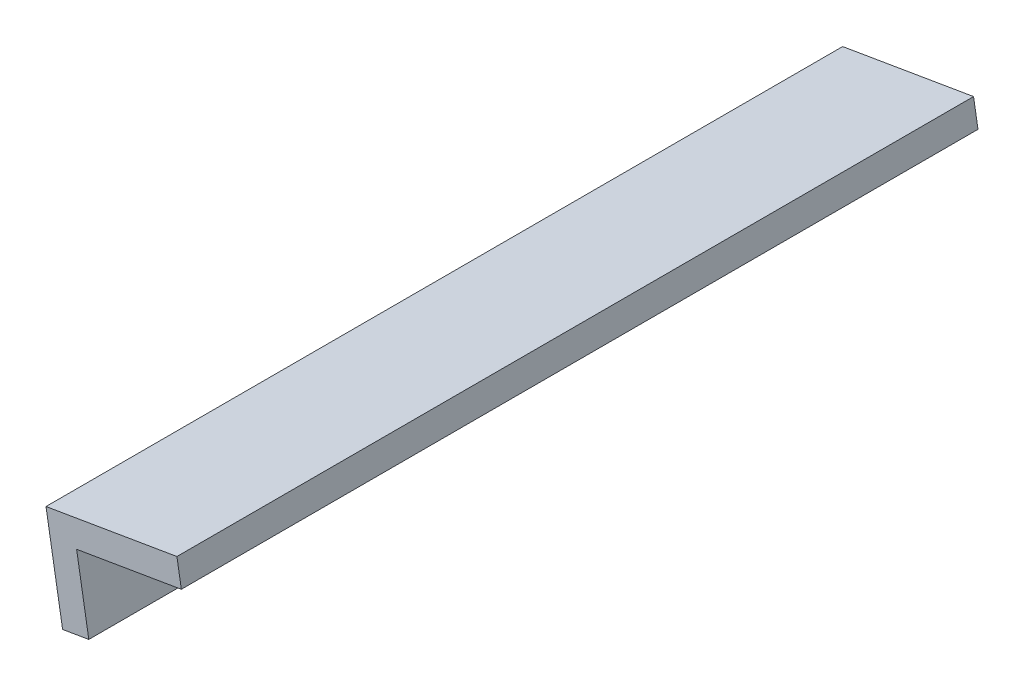
ISO-10303-21;
HEADER;
FILE_DESCRIPTION(('STEP AP214'),'2;1');
FILE_NAME('part.step','',(''),(''),'','','');
FILE_SCHEMA(('AUTOMOTIVE_DESIGN { 1 0 10303 214 1 1 1 1 }'));
ENDSEC;
DATA;
#1=APPLICATION_CONTEXT('core data for automotive mechanical design processes');
#2=APPLICATION_PROTOCOL_DEFINITION('international standard','automotive_design',2000,#1);
#3=PRODUCT_CONTEXT('',#1,'mechanical');
#4=PRODUCT('Part','Part','',(#3));
#5=PRODUCT_RELATED_PRODUCT_CATEGORY('part','',(#4));
#6=PRODUCT_DEFINITION_FORMATION('','',#4);
#7=PRODUCT_DEFINITION_CONTEXT('part definition',#1,'design');
#8=PRODUCT_DEFINITION('design','',#6,#7);
#9=PRODUCT_DEFINITION_SHAPE('','',#8);
#10=(LENGTH_UNIT() NAMED_UNIT(*) SI_UNIT(.MILLI.,.METRE.));
#11=(NAMED_UNIT(*) PLANE_ANGLE_UNIT() SI_UNIT($,.RADIAN.));
#12=(NAMED_UNIT(*) SI_UNIT($,.STERADIAN.) SOLID_ANGLE_UNIT());
#13=UNCERTAINTY_MEASURE_WITH_UNIT(LENGTH_MEASURE(1.E-05),#10,'distance_accuracy_value','');
#14=(GEOMETRIC_REPRESENTATION_CONTEXT(3) GLOBAL_UNCERTAINTY_ASSIGNED_CONTEXT((#13)) GLOBAL_UNIT_ASSIGNED_CONTEXT((#10,
#11,#12)) REPRESENTATION_CONTEXT('',''));
#15=CARTESIAN_POINT('',(0.,0.,0.));
#16=DIRECTION('',(0.,0.,1.));
#17=DIRECTION('',(1.,0.,0.));
#18=AXIS2_PLACEMENT_3D('',#15,#16,#17);
#19=CARTESIAN_POINT('',(-124.766828541344,248.500328158799,-152.4));
#20=DIRECTION('',(-0.98599202161082,-0.166792485801395,0.));
#21=DIRECTION('',(0.166792485801395,-0.98599202161082,0.));
#22=AXIS2_PLACEMENT_3D('',#19,#20,#21);
#23=PLANE('',#22);
#24=DIRECTION('',(0.166792485801395,-0.98599202161082,0.));
#25=VECTOR('',#24,1.);
#26=CARTESIAN_POINT('',(-124.766828541344,248.500328158799,0.));
#27=LINE('',#26,#25);
#28=CARTESIAN_POINT('',(-124.766828541344,248.500328158799,0.));
#29=VERTEX_POINT('',#28);
#30=CARTESIAN_POINT('',(-121.589431686828,229.717180147113,0.));
#31=VERTEX_POINT('',#30);
#32=EDGE_CURVE('E117',#29,#31,#27,.T.);
#33=ORIENTED_EDGE('',*,*,#32,.F.);
#34=DIRECTION('',(0.,0.,1.));
#35=VECTOR('',#34,1.);
#36=CARTESIAN_POINT('',(-124.766828541344,248.500328158799,-152.4));
#37=LINE('',#36,#35);
#38=CARTESIAN_POINT('',(-124.766828541344,248.500328158799,-152.4));
#39=VERTEX_POINT('',#38);
#40=EDGE_CURVE('E11',#39,#29,#37,.T.);
#41=ORIENTED_EDGE('',*,*,#40,.F.);
#42=DIRECTION('',(0.166792485801395,-0.98599202161082,0.));
#43=VECTOR('',#42,1.);
#44=CARTESIAN_POINT('',(-124.766828541344,248.500328158799,-152.4));
#45=LINE('',#44,#43);
#46=CARTESIAN_POINT('',(-121.589431686828,229.717180147113,-152.4));
#47=VERTEX_POINT('',#46);
#48=EDGE_CURVE('E131',#39,#47,#45,.T.);
#49=ORIENTED_EDGE('',*,*,#48,.T.);
#50=DIRECTION('',(0.,0.,1.));
#51=VECTOR('',#50,1.);
#52=CARTESIAN_POINT('',(-121.589431686828,229.717180147113,-152.4));
#53=LINE('',#52,#51);
#54=EDGE_CURVE('E35',#47,#31,#53,.T.);
#55=ORIENTED_EDGE('',*,*,#54,.T.);
#56=EDGE_LOOP('',(#33,#41,#49,#55));
#57=FACE_BOUND('',#56,.T.);
#58=ADVANCED_FACE('F32',(#57),#23,.T.);
#59=CARTESIAN_POINT('',(-124.766828541344,248.500328158799,-152.4));
#60=DIRECTION('',(-0.166792485801395,0.98599202161082,0.));
#61=DIRECTION('',(-0.98599202161082,-0.166792485801395,0.));
#62=AXIS2_PLACEMENT_3D('',#59,#60,#61);
#63=PLANE('',#62);
#64=DIRECTION('',(-0.98599202161082,-0.166792485801395,0.));
#65=VECTOR('',#64,1.);
#66=CARTESIAN_POINT('',(-124.766828541344,248.500328158799,0.));
#67=LINE('',#66,#65);
#68=CARTESIAN_POINT('',(-99.7226311924294,252.736857298154,0.));
#69=VERTEX_POINT('',#68);
#70=EDGE_CURVE('E129',#69,#29,#67,.T.);
#71=ORIENTED_EDGE('',*,*,#70,.F.);
#72=DIRECTION('',(0.,0.,1.));
#73=VECTOR('',#72,1.);
#74=CARTESIAN_POINT('',(-99.7226311924294,252.736857298154,-152.4));
#75=LINE('',#74,#73);
#76=CARTESIAN_POINT('',(-99.7226311924294,252.736857298154,-152.4));
#77=VERTEX_POINT('',#76);
#78=EDGE_CURVE('E41',#77,#69,#75,.T.);
#79=ORIENTED_EDGE('',*,*,#78,.F.);
#80=DIRECTION('',(-0.98599202161082,-0.166792485801395,0.));
#81=VECTOR('',#80,1.);
#82=CARTESIAN_POINT('',(-124.766828541344,248.500328158799,-152.4));
#83=LINE('',#82,#81);
#84=EDGE_CURVE('E107',#77,#39,#83,.T.);
#85=ORIENTED_EDGE('',*,*,#84,.T.);
#86=ORIENTED_EDGE('',*,*,#40,.T.);
#87=EDGE_LOOP('',(#71,#79,#85,#86));
#88=FACE_BOUND('',#87,.T.);
#89=ADVANCED_FACE('F139',(#88),#63,.T.);
#90=CARTESIAN_POINT('',(-99.7226311924294,252.736857298154,-152.4));
#91=DIRECTION('',(0.98599202161082,0.166792485801394,0.));
#92=DIRECTION('',(-0.166792485801394,0.98599202161082,0.));
#93=AXIS2_PLACEMENT_3D('',#90,#91,#92);
#94=PLANE('',#93);
#95=DIRECTION('',(-0.166792485801394,0.98599202161082,0.));
#96=VECTOR('',#95,1.);
#97=CARTESIAN_POINT('',(-99.7226311924294,252.736857298154,0.));
#98=LINE('',#97,#96);
#99=CARTESIAN_POINT('',(-98.8753253645583,247.728017828371,0.));
#100=VERTEX_POINT('',#99);
#101=EDGE_CURVE('E94',#100,#69,#98,.T.);
#102=ORIENTED_EDGE('',*,*,#101,.F.);
#103=DIRECTION('',(0.,0.,1.));
#104=VECTOR('',#103,1.);
#105=CARTESIAN_POINT('',(-98.8753253645583,247.728017828371,-152.4));
#106=LINE('',#105,#104);
#107=CARTESIAN_POINT('',(-98.8753253645583,247.728017828371,-152.4));
#108=VERTEX_POINT('',#107);
#109=EDGE_CURVE('E89',#108,#100,#106,.T.);
#110=ORIENTED_EDGE('',*,*,#109,.F.);
#111=DIRECTION('',(-0.166792485801394,0.98599202161082,0.));
#112=VECTOR('',#111,1.);
#113=CARTESIAN_POINT('',(-99.7226311924294,252.736857298154,-152.4));
#114=LINE('',#113,#112);
#115=EDGE_CURVE('E92',#108,#77,#114,.T.);
#116=ORIENTED_EDGE('',*,*,#115,.T.);
#117=ORIENTED_EDGE('',*,*,#78,.T.);
#118=EDGE_LOOP('',(#102,#110,#116,#117));
#119=FACE_BOUND('',#118,.T.);
#120=ADVANCED_FACE('F91',(#119),#94,.T.);
#121=CARTESIAN_POINT('',(-98.8753253645583,247.728017828371,-152.4));
#122=DIRECTION('',(0.166792485801395,-0.98599202161082,0.));
#123=DIRECTION('',(0.98599202161082,0.166792485801395,0.));
#124=AXIS2_PLACEMENT_3D('',#121,#122,#123);
#125=PLANE('',#124);
#126=DIRECTION('',(0.98599202161082,0.166792485801395,0.));
#127=VECTOR('',#126,1.);
#128=CARTESIAN_POINT('',(-98.8753253645583,247.728017828371,0.));
#129=LINE('',#128,#127);
#130=CARTESIAN_POINT('',(-118.91068324369,244.338794516887,0.));
#131=VERTEX_POINT('',#130);
#132=EDGE_CURVE('E126',#131,#100,#129,.T.);
#133=ORIENTED_EDGE('',*,*,#132,.F.);
#134=DIRECTION('',(0.,0.,1.));
#135=VECTOR('',#134,1.);
#136=CARTESIAN_POINT('',(-118.91068324369,244.338794516887,-152.4));
#137=LINE('',#136,#135);
#138=CARTESIAN_POINT('',(-118.91068324369,244.338794516887,-152.4));
#139=VERTEX_POINT('',#138);
#140=EDGE_CURVE('E99',#139,#131,#137,.T.);
#141=ORIENTED_EDGE('',*,*,#140,.F.);
#142=DIRECTION('',(0.98599202161082,0.166792485801395,0.));
#143=VECTOR('',#142,1.);
#144=CARTESIAN_POINT('',(-98.8753253645583,247.728017828371,-152.4));
#145=LINE('',#144,#143);
#146=EDGE_CURVE('E105',#139,#108,#145,.T.);
#147=ORIENTED_EDGE('',*,*,#146,.T.);
#148=ORIENTED_EDGE('',*,*,#109,.T.);
#149=EDGE_LOOP('',(#133,#141,#147,#148));
#150=FACE_BOUND('',#149,.T.);
#151=ADVANCED_FACE('F109',(#150),#125,.T.);
#152=CARTESIAN_POINT('',(-118.91068324369,244.338794516887,-152.4));
#153=DIRECTION('',(0.98599202161082,0.166792485801395,0.));
#154=DIRECTION('',(-0.166792485801395,0.98599202161082,0.));
#155=AXIS2_PLACEMENT_3D('',#152,#153,#154);
#156=PLANE('',#155);
#157=DIRECTION('',(-0.166792485801395,0.98599202161082,0.));
#158=VECTOR('',#157,1.);
#159=CARTESIAN_POINT('',(-118.91068324369,244.338794516887,0.));
#160=LINE('',#159,#158);
#161=CARTESIAN_POINT('',(-116.580592217045,230.564485974984,0.));
#162=VERTEX_POINT('',#161);
#163=EDGE_CURVE('E123',#162,#131,#160,.T.);
#164=ORIENTED_EDGE('',*,*,#163,.F.);
#165=DIRECTION('',(0.,0.,1.));
#166=VECTOR('',#165,1.);
#167=CARTESIAN_POINT('',(-116.580592217045,230.564485974984,-152.4));
#168=LINE('',#167,#166);
#169=CARTESIAN_POINT('',(-116.580592217045,230.564485974984,-152.4));
#170=VERTEX_POINT('',#169);
#171=EDGE_CURVE('E134',#170,#162,#168,.T.);
#172=ORIENTED_EDGE('',*,*,#171,.F.);
#173=DIRECTION('',(-0.166792485801395,0.98599202161082,0.));
#174=VECTOR('',#173,1.);
#175=CARTESIAN_POINT('',(-118.91068324369,244.338794516887,-152.4));
#176=LINE('',#175,#174);
#177=EDGE_CURVE('E110',#170,#139,#176,.T.);
#178=ORIENTED_EDGE('',*,*,#177,.T.);
#179=ORIENTED_EDGE('',*,*,#140,.T.);
#180=EDGE_LOOP('',(#164,#172,#178,#179));
#181=FACE_BOUND('',#180,.T.);
#182=ADVANCED_FACE('F152',(#181),#156,.T.);
#183=CARTESIAN_POINT('',(-116.580592217045,230.564485974984,-152.4));
#184=DIRECTION('',(0.166792485801394,-0.98599202161082,0.));
#185=DIRECTION('',(0.98599202161082,0.166792485801394,0.));
#186=AXIS2_PLACEMENT_3D('',#183,#184,#185);
#187=PLANE('',#186);
#188=DIRECTION('',(0.98599202161082,0.166792485801394,0.));
#189=VECTOR('',#188,1.);
#190=CARTESIAN_POINT('',(-116.580592217045,230.564485974984,0.));
#191=LINE('',#190,#189);
#192=EDGE_CURVE('E120',#31,#162,#191,.T.);
#193=ORIENTED_EDGE('',*,*,#192,.F.);
#194=ORIENTED_EDGE('',*,*,#54,.F.);
#195=DIRECTION('',(0.98599202161082,0.166792485801394,0.));
#196=VECTOR('',#195,1.);
#197=CARTESIAN_POINT('',(-116.580592217045,230.564485974984,-152.4));
#198=LINE('',#197,#196);
#199=EDGE_CURVE('E112',#47,#170,#198,.T.);
#200=ORIENTED_EDGE('',*,*,#199,.T.);
#201=ORIENTED_EDGE('',*,*,#171,.T.);
#202=EDGE_LOOP('',(#193,#194,#200,#201));
#203=FACE_BOUND('',#202,.T.);
#204=ADVANCED_FACE('F136',(#203),#187,.T.);
#205=CARTESIAN_POINT('',(-121.589431686828,229.717180147113,-152.4));
#206=DIRECTION('',(0.,0.,-1.));
#207=DIRECTION('',(-1.,0.,0.));
#208=AXIS2_PLACEMENT_3D('',#205,#206,#207);
#209=PLANE('',#208);
#210=ORIENTED_EDGE('',*,*,#48,.F.);
#211=ORIENTED_EDGE('',*,*,#84,.F.);
#212=ORIENTED_EDGE('',*,*,#115,.F.);
#213=ORIENTED_EDGE('',*,*,#146,.F.);
#214=ORIENTED_EDGE('',*,*,#177,.F.);
#215=ORIENTED_EDGE('',*,*,#199,.F.);
#216=EDGE_LOOP('',(#210,#211,#212,#213,#214,#215));
#217=FACE_BOUND('',#216,.T.);
#218=ADVANCED_FACE('F103',(#217),#209,.T.);
#219=CARTESIAN_POINT('',(-121.589431686828,229.717180147113,0.));
#220=DIRECTION('',(0.,0.,-1.));
#221=DIRECTION('',(-1.,0.,0.));
#222=AXIS2_PLACEMENT_3D('',#219,#220,#221);
#223=PLANE('',#222);
#224=ORIENTED_EDGE('',*,*,#32,.T.);
#225=ORIENTED_EDGE('',*,*,#192,.T.);
#226=ORIENTED_EDGE('',*,*,#163,.T.);
#227=ORIENTED_EDGE('',*,*,#132,.T.);
#228=ORIENTED_EDGE('',*,*,#101,.T.);
#229=ORIENTED_EDGE('',*,*,#70,.T.);
#230=EDGE_LOOP('',(#224,#225,#226,#227,#228,#229));
#231=FACE_BOUND('',#230,.T.);
#232=ADVANCED_FACE('F138',(#231),#223,.F.);
#233=CLOSED_SHELL('',(#58,#89,#120,#151,#182,#204,#218,#232));
#234=MANIFOLD_SOLID_BREP('B2',#233);
#235=ADVANCED_BREP_SHAPE_REPRESENTATION('',(#18,#234),#14);
#236=SHAPE_DEFINITION_REPRESENTATION(#9,#235);
ENDSEC;
END-ISO-10303-21;
